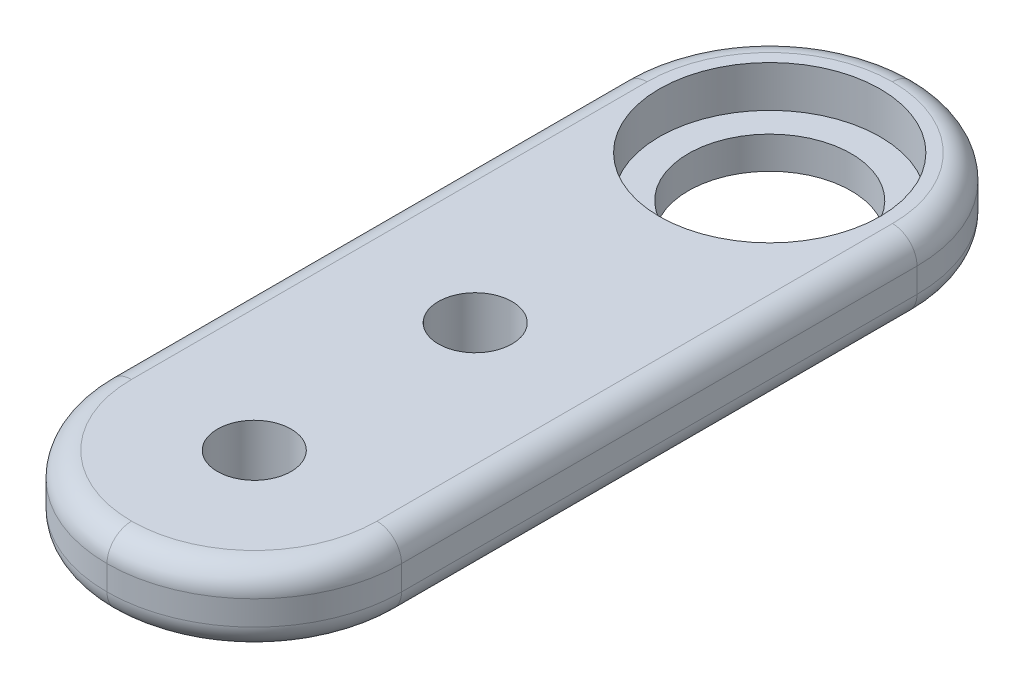
ISO-10303-21;
HEADER;
FILE_DESCRIPTION(('STEP AP214'),'2;1');
FILE_NAME('part.step','',(''),(''),'','','');
FILE_SCHEMA(('AUTOMOTIVE_DESIGN { 1 0 10303 214 1 1 1 1 }'));
ENDSEC;
DATA;
#1=APPLICATION_CONTEXT('core data for automotive mechanical design processes');
#2=APPLICATION_PROTOCOL_DEFINITION('international standard','automotive_design',2000,#1);
#3=PRODUCT_CONTEXT('',#1,'mechanical');
#4=PRODUCT('Part','Part','',(#3));
#5=PRODUCT_RELATED_PRODUCT_CATEGORY('part','',(#4));
#6=PRODUCT_DEFINITION_FORMATION('','',#4);
#7=PRODUCT_DEFINITION_CONTEXT('part definition',#1,'design');
#8=PRODUCT_DEFINITION('design','',#6,#7);
#9=PRODUCT_DEFINITION_SHAPE('','',#8);
#10=(LENGTH_UNIT() NAMED_UNIT(*) SI_UNIT(.MILLI.,.METRE.));
#11=(NAMED_UNIT(*) PLANE_ANGLE_UNIT() SI_UNIT($,.RADIAN.));
#12=(NAMED_UNIT(*) SI_UNIT($,.STERADIAN.) SOLID_ANGLE_UNIT());
#13=UNCERTAINTY_MEASURE_WITH_UNIT(LENGTH_MEASURE(1.E-05),#10,'distance_accuracy_value','');
#14=(GEOMETRIC_REPRESENTATION_CONTEXT(3) GLOBAL_UNCERTAINTY_ASSIGNED_CONTEXT((#13)) GLOBAL_UNIT_ASSIGNED_CONTEXT((#10,
#11,#12)) REPRESENTATION_CONTEXT('',''));
#15=CARTESIAN_POINT('',(0.,0.,0.));
#16=DIRECTION('',(0.,0.,1.));
#17=DIRECTION('',(1.,0.,0.));
#18=AXIS2_PLACEMENT_3D('',#15,#16,#17);
#19=CARTESIAN_POINT('',(0.,6.35,0.));
#20=DIRECTION('',(0.,-1.,0.));
#21=DIRECTION('',(0.,0.,-1.));
#22=AXIS2_PLACEMENT_3D('',#19,#20,#21);
#23=PLANE('',#22);
#24=CARTESIAN_POINT('',(0.,6.35,-22.225));
#25=DIRECTION('',(0.,1.,0.));
#26=DIRECTION('',(0.,0.,1.));
#27=AXIS2_PLACEMENT_3D('',#24,#25,#26);
#28=CIRCLE('',#27,9.525);
#29=CARTESIAN_POINT('',(0.,6.35,-12.7));
#30=VERTEX_POINT('',#29);
#31=EDGE_CURVE('E278',#30,#30,#28,.T.);
#32=ORIENTED_EDGE('',*,*,#31,.F.);
#33=EDGE_LOOP('',(#32));
#34=FACE_BOUND('',#33,.T.);
#35=CARTESIAN_POINT('',(0.,6.35,-22.225));
#36=DIRECTION('',(0.,-1.,0.));
#37=DIRECTION('',(0.,0.,-1.));
#38=AXIS2_PLACEMENT_3D('',#35,#36,#37);
#39=CIRCLE('',#38,10.5833333333333);
#40=CARTESIAN_POINT('',(10.5833333333333,6.35,-22.225));
#41=VERTEX_POINT('',#40);
#42=CARTESIAN_POINT('',(0.,6.35,-32.8083333333333));
#43=VERTEX_POINT('',#42);
#44=EDGE_CURVE('E54',#41,#43,#39,.F.);
#45=ORIENTED_EDGE('',*,*,#44,.T.);
#46=CARTESIAN_POINT('',(0.,6.35,-22.225));
#47=DIRECTION('',(0.,-1.,0.));
#48=DIRECTION('',(0.,0.,-1.));
#49=AXIS2_PLACEMENT_3D('',#46,#47,#48);
#50=CIRCLE('',#49,10.5833333333333);
#51=CARTESIAN_POINT('',(-10.5833333333333,6.35,-22.225));
#52=VERTEX_POINT('',#51);
#53=EDGE_CURVE('E187',#43,#52,#50,.F.);
#54=ORIENTED_EDGE('',*,*,#53,.T.);
#55=DIRECTION('',(0.,0.,1.));
#56=VECTOR('',#55,1.);
#57=CARTESIAN_POINT('',(-10.5833333333333,6.35,0.));
#58=LINE('',#57,#56);
#59=CARTESIAN_POINT('',(-10.5833333333333,6.35,22.225));
#60=VERTEX_POINT('',#59);
#61=EDGE_CURVE('E179',#52,#60,#58,.T.);
#62=ORIENTED_EDGE('',*,*,#61,.T.);
#63=CARTESIAN_POINT('',(0.,6.35,22.225));
#64=DIRECTION('',(0.,-1.,0.));
#65=DIRECTION('',(0.,0.,-1.));
#66=AXIS2_PLACEMENT_3D('',#63,#64,#65);
#67=CIRCLE('',#66,10.5833333333333);
#68=CARTESIAN_POINT('',(0.,6.35,32.8083333333333));
#69=VERTEX_POINT('',#68);
#70=EDGE_CURVE('E181',#60,#69,#67,.F.);
#71=ORIENTED_EDGE('',*,*,#70,.T.);
#72=CARTESIAN_POINT('',(0.,6.35,22.225));
#73=DIRECTION('',(0.,-1.,0.));
#74=DIRECTION('',(0.,0.,-1.));
#75=AXIS2_PLACEMENT_3D('',#72,#73,#74);
#76=CIRCLE('',#75,10.5833333333333);
#77=CARTESIAN_POINT('',(10.5833333333333,6.35,22.225));
#78=VERTEX_POINT('',#77);
#79=EDGE_CURVE('E183',#69,#78,#76,.F.);
#80=ORIENTED_EDGE('',*,*,#79,.T.);
#81=DIRECTION('',(0.,0.,-1.));
#82=VECTOR('',#81,1.);
#83=CARTESIAN_POINT('',(10.5833333333333,6.35,0.));
#84=LINE('',#83,#82);
#85=EDGE_CURVE('E59',#78,#41,#84,.T.);
#86=ORIENTED_EDGE('',*,*,#85,.T.);
#87=EDGE_LOOP('',(#45,#54,#62,#71,#80,#86));
#88=FACE_BOUND('',#87,.T.);
#89=CARTESIAN_POINT('',(0.,6.35,3.175));
#90=DIRECTION('',(0.,1.,0.));
#91=DIRECTION('',(0.,0.,1.));
#92=AXIS2_PLACEMENT_3D('',#89,#90,#91);
#93=CIRCLE('',#92,3.175);
#94=CARTESIAN_POINT('',(0.,6.35,6.35));
#95=VERTEX_POINT('',#94);
#96=EDGE_CURVE('E267',#95,#95,#93,.T.);
#97=ORIENTED_EDGE('',*,*,#96,.F.);
#98=EDGE_LOOP('',(#97));
#99=FACE_BOUND('',#98,.T.);
#100=CARTESIAN_POINT('',(0.,6.35,22.225));
#101=DIRECTION('',(0.,1.,0.));
#102=DIRECTION('',(0.,0.,1.));
#103=AXIS2_PLACEMENT_3D('',#100,#101,#102);
#104=CIRCLE('',#103,3.175);
#105=CARTESIAN_POINT('',(0.,6.35,25.4));
#106=VERTEX_POINT('',#105);
#107=EDGE_CURVE('E271',#106,#106,#104,.T.);
#108=ORIENTED_EDGE('',*,*,#107,.F.);
#109=EDGE_LOOP('',(#108));
#110=FACE_BOUND('',#109,.T.);
#111=ADVANCED_FACE('F37',(#34,#88,#99,#110),#23,.F.);
#112=CARTESIAN_POINT('',(0.,0.,0.));
#113=DIRECTION('',(0.,-1.,0.));
#114=DIRECTION('',(0.,0.,-1.));
#115=AXIS2_PLACEMENT_3D('',#112,#113,#114);
#116=PLANE('',#115);
#117=CARTESIAN_POINT('',(0.,0.,-22.225));
#118=DIRECTION('',(0.,1.,0.));
#119=DIRECTION('',(0.,0.,1.));
#120=AXIS2_PLACEMENT_3D('',#117,#118,#119);
#121=CIRCLE('',#120,7.01680789502882);
#122=CARTESIAN_POINT('',(0.,0.,-15.2081921049712));
#123=VERTEX_POINT('',#122);
#124=EDGE_CURVE('E286',#123,#123,#121,.T.);
#125=ORIENTED_EDGE('',*,*,#124,.T.);
#126=EDGE_LOOP('',(#125));
#127=FACE_BOUND('',#126,.T.);
#128=DIRECTION('',(0.,0.,-1.));
#129=VECTOR('',#128,1.);
#130=CARTESIAN_POINT('',(10.5833333333333,0.,22.225));
#131=LINE('',#130,#129);
#132=CARTESIAN_POINT('',(10.5833333333333,0.,-22.225));
#133=VERTEX_POINT('',#132);
#134=CARTESIAN_POINT('',(10.5833333333333,0.,22.225));
#135=VERTEX_POINT('',#134);
#136=EDGE_CURVE('E152',#133,#135,#131,.F.);
#137=ORIENTED_EDGE('',*,*,#136,.T.);
#138=CARTESIAN_POINT('',(0.,0.,22.225));
#139=DIRECTION('',(0.,-1.,0.));
#140=DIRECTION('',(0.,0.,-1.));
#141=AXIS2_PLACEMENT_3D('',#138,#139,#140);
#142=CIRCLE('',#141,10.5833333333333);
#143=CARTESIAN_POINT('',(0.,0.,32.8083333333333));
#144=VERTEX_POINT('',#143);
#145=EDGE_CURVE('E132',#135,#144,#142,.T.);
#146=ORIENTED_EDGE('',*,*,#145,.T.);
#147=CARTESIAN_POINT('',(0.,0.,22.225));
#148=DIRECTION('',(0.,-1.,0.));
#149=DIRECTION('',(0.,0.,-1.));
#150=AXIS2_PLACEMENT_3D('',#147,#148,#149);
#151=CIRCLE('',#150,10.5833333333333);
#152=CARTESIAN_POINT('',(-10.5833333333333,0.,22.225));
#153=VERTEX_POINT('',#152);
#154=EDGE_CURVE('E140',#144,#153,#151,.T.);
#155=ORIENTED_EDGE('',*,*,#154,.T.);
#156=DIRECTION('',(0.,0.,1.));
#157=VECTOR('',#156,1.);
#158=CARTESIAN_POINT('',(-10.5833333333333,0.,-22.225));
#159=LINE('',#158,#157);
#160=CARTESIAN_POINT('',(-10.5833333333333,0.,-22.225));
#161=VERTEX_POINT('',#160);
#162=EDGE_CURVE('E146',#153,#161,#159,.F.);
#163=ORIENTED_EDGE('',*,*,#162,.T.);
#164=CARTESIAN_POINT('',(0.,0.,-22.225));
#165=DIRECTION('',(0.,-1.,0.));
#166=DIRECTION('',(0.,0.,-1.));
#167=AXIS2_PLACEMENT_3D('',#164,#165,#166);
#168=CIRCLE('',#167,10.5833333333333);
#169=CARTESIAN_POINT('',(0.,0.,-32.8083333333333));
#170=VERTEX_POINT('',#169);
#171=EDGE_CURVE('E245',#161,#170,#168,.T.);
#172=ORIENTED_EDGE('',*,*,#171,.T.);
#173=CARTESIAN_POINT('',(0.,0.,-22.225));
#174=DIRECTION('',(0.,-1.,0.));
#175=DIRECTION('',(0.,0.,-1.));
#176=AXIS2_PLACEMENT_3D('',#173,#174,#175);
#177=CIRCLE('',#176,10.5833333333333);
#178=EDGE_CURVE('E157',#170,#133,#177,.T.);
#179=ORIENTED_EDGE('',*,*,#178,.T.);
#180=EDGE_LOOP('',(#137,#146,#155,#163,#172,#179));
#181=FACE_BOUND('',#180,.T.);
#182=CARTESIAN_POINT('',(0.,0.,3.175));
#183=DIRECTION('',(0.,1.,0.));
#184=DIRECTION('',(0.,0.,1.));
#185=AXIS2_PLACEMENT_3D('',#182,#183,#184);
#186=CIRCLE('',#185,3.175);
#187=CARTESIAN_POINT('',(0.,0.,6.35));
#188=VERTEX_POINT('',#187);
#189=EDGE_CURVE('E268',#188,#188,#186,.T.);
#190=ORIENTED_EDGE('',*,*,#189,.T.);
#191=EDGE_LOOP('',(#190));
#192=FACE_BOUND('',#191,.T.);
#193=CARTESIAN_POINT('',(0.,0.,22.225));
#194=DIRECTION('',(0.,1.,0.));
#195=DIRECTION('',(0.,0.,1.));
#196=AXIS2_PLACEMENT_3D('',#193,#194,#195);
#197=CIRCLE('',#196,3.175);
#198=CARTESIAN_POINT('',(0.,0.,25.4));
#199=VERTEX_POINT('',#198);
#200=EDGE_CURVE('E240',#199,#199,#197,.T.);
#201=ORIENTED_EDGE('',*,*,#200,.T.);
#202=EDGE_LOOP('',(#201));
#203=FACE_BOUND('',#202,.T.);
#204=ADVANCED_FACE('F149',(#127,#181,#192,#203),#116,.T.);
#205=CARTESIAN_POINT('',(12.7,6.35,34.925));
#206=DIRECTION('',(-1.,0.,0.));
#207=DIRECTION('',(0.,0.,1.));
#208=AXIS2_PLACEMENT_3D('',#205,#206,#207);
#209=PLANE('',#208);
#210=DIRECTION('',(0.,-1.,0.));
#211=VECTOR('',#210,1.);
#212=CARTESIAN_POINT('',(12.7,6.35,22.225));
#213=LINE('',#212,#211);
#214=CARTESIAN_POINT('',(12.7,4.23333333333333,22.225));
#215=VERTEX_POINT('',#214);
#216=CARTESIAN_POINT('',(12.7,2.11666666666667,22.225));
#217=VERTEX_POINT('',#216);
#218=EDGE_CURVE('E232',#215,#217,#213,.T.);
#219=ORIENTED_EDGE('',*,*,#218,.T.);
#220=DIRECTION('',(0.,0.,-1.));
#221=VECTOR('',#220,1.);
#222=CARTESIAN_POINT('',(12.7,2.11666666666667,-22.225));
#223=LINE('',#222,#221);
#224=CARTESIAN_POINT('',(12.7,2.11666666666667,-22.225));
#225=VERTEX_POINT('',#224);
#226=EDGE_CURVE('E164',#217,#225,#223,.T.);
#227=ORIENTED_EDGE('',*,*,#226,.T.);
#228=DIRECTION('',(0.,-1.,0.));
#229=VECTOR('',#228,1.);
#230=CARTESIAN_POINT('',(12.7,6.35,-22.225));
#231=LINE('',#230,#229);
#232=CARTESIAN_POINT('',(12.7,4.23333333333333,-22.225));
#233=VERTEX_POINT('',#232);
#234=EDGE_CURVE('E147',#225,#233,#231,.F.);
#235=ORIENTED_EDGE('',*,*,#234,.T.);
#236=DIRECTION('',(0.,0.,-1.));
#237=VECTOR('',#236,1.);
#238=CARTESIAN_POINT('',(12.7,4.23333333333333,34.925));
#239=LINE('',#238,#237);
#240=EDGE_CURVE('E162',#233,#215,#239,.F.);
#241=ORIENTED_EDGE('',*,*,#240,.T.);
#242=EDGE_LOOP('',(#219,#227,#235,#241));
#243=FACE_BOUND('',#242,.T.);
#244=ADVANCED_FACE('F259',(#243),#209,.F.);
#245=CARTESIAN_POINT('',(-12.7,6.35,34.925));
#246=DIRECTION('',(1.,0.,0.));
#247=DIRECTION('',(0.,0.,-1.));
#248=AXIS2_PLACEMENT_3D('',#245,#246,#247);
#249=PLANE('',#248);
#250=DIRECTION('',(0.,-1.,0.));
#251=VECTOR('',#250,1.);
#252=CARTESIAN_POINT('',(-12.7,6.35,-22.225));
#253=LINE('',#252,#251);
#254=CARTESIAN_POINT('',(-12.7,4.23333333333333,-22.225));
#255=VERTEX_POINT('',#254);
#256=CARTESIAN_POINT('',(-12.7,2.11666666666667,-22.225));
#257=VERTEX_POINT('',#256);
#258=EDGE_CURVE('E260',#255,#257,#253,.T.);
#259=ORIENTED_EDGE('',*,*,#258,.T.);
#260=DIRECTION('',(0.,0.,1.));
#261=VECTOR('',#260,1.);
#262=CARTESIAN_POINT('',(-12.7,2.11666666666667,22.225));
#263=LINE('',#262,#261);
#264=CARTESIAN_POINT('',(-12.7,2.11666666666667,22.225));
#265=VERTEX_POINT('',#264);
#266=EDGE_CURVE('E177',#257,#265,#263,.T.);
#267=ORIENTED_EDGE('',*,*,#266,.T.);
#268=DIRECTION('',(0.,-1.,0.));
#269=VECTOR('',#268,1.);
#270=CARTESIAN_POINT('',(-12.7,6.35,22.225));
#271=LINE('',#270,#269);
#272=CARTESIAN_POINT('',(-12.7,4.23333333333333,22.225));
#273=VERTEX_POINT('',#272);
#274=EDGE_CURVE('E263',#265,#273,#271,.F.);
#275=ORIENTED_EDGE('',*,*,#274,.T.);
#276=DIRECTION('',(0.,0.,1.));
#277=VECTOR('',#276,1.);
#278=CARTESIAN_POINT('',(-12.7,4.23333333333333,34.925));
#279=LINE('',#278,#277);
#280=EDGE_CURVE('E175',#273,#255,#279,.F.);
#281=ORIENTED_EDGE('',*,*,#280,.T.);
#282=EDGE_LOOP('',(#259,#267,#275,#281));
#283=FACE_BOUND('',#282,.T.);
#284=ADVANCED_FACE('F314',(#283),#249,.F.);
#285=CARTESIAN_POINT('',(0.,6.35,3.175));
#286=DIRECTION('',(0.,-1.,0.));
#287=DIRECTION('',(0.,0.,-1.));
#288=AXIS2_PLACEMENT_3D('',#285,#286,#287);
#289=CYLINDRICAL_SURFACE('',#288,3.175);
#290=ORIENTED_EDGE('',*,*,#96,.T.);
#291=EDGE_LOOP('',(#290));
#292=FACE_BOUND('',#291,.T.);
#293=ORIENTED_EDGE('',*,*,#189,.F.);
#294=EDGE_LOOP('',(#293));
#295=FACE_BOUND('',#294,.T.);
#296=ADVANCED_FACE('F311',(#292,#295),#289,.F.);
#297=CARTESIAN_POINT('',(0.,6.35,22.225));
#298=DIRECTION('',(0.,-1.,0.));
#299=DIRECTION('',(0.,0.,-1.));
#300=AXIS2_PLACEMENT_3D('',#297,#298,#299);
#301=CYLINDRICAL_SURFACE('',#300,3.175);
#302=ORIENTED_EDGE('',*,*,#107,.T.);
#303=EDGE_LOOP('',(#302));
#304=FACE_BOUND('',#303,.T.);
#305=ORIENTED_EDGE('',*,*,#200,.F.);
#306=EDGE_LOOP('',(#305));
#307=FACE_BOUND('',#306,.T.);
#308=ADVANCED_FACE('F327',(#304,#307),#301,.F.);
#309=CARTESIAN_POINT('',(0.,6.35,-22.225));
#310=DIRECTION('',(0.,-1.,0.));
#311=DIRECTION('',(0.,0.,-1.));
#312=AXIS2_PLACEMENT_3D('',#309,#310,#311);
#313=CYLINDRICAL_SURFACE('',#312,12.7);
#314=ORIENTED_EDGE('',*,*,#234,.F.);
#315=CARTESIAN_POINT('',(0.,2.11666666666667,-22.225));
#316=DIRECTION('',(0.,-1.,0.));
#317=DIRECTION('',(0.,0.,-1.));
#318=AXIS2_PLACEMENT_3D('',#315,#316,#317);
#319=CIRCLE('',#318,12.7);
#320=CARTESIAN_POINT('',(0.,2.11666666666667,-34.925));
#321=VERTEX_POINT('',#320);
#322=EDGE_CURVE('E168',#225,#321,#319,.F.);
#323=ORIENTED_EDGE('',*,*,#322,.T.);
#324=DIRECTION('',(0.,-1.,0.));
#325=VECTOR('',#324,1.);
#326=CARTESIAN_POINT('',(0.,6.35,-34.925));
#327=LINE('',#326,#325);
#328=CARTESIAN_POINT('',(0.,4.23333333333333,-34.925));
#329=VERTEX_POINT('',#328);
#330=EDGE_CURVE('E237',#329,#321,#327,.T.);
#331=ORIENTED_EDGE('',*,*,#330,.F.);
#332=CARTESIAN_POINT('',(0.,4.23333333333333,-22.225));
#333=DIRECTION('',(0.,-1.,0.));
#334=DIRECTION('',(0.,0.,-1.));
#335=AXIS2_PLACEMENT_3D('',#332,#333,#334);
#336=CIRCLE('',#335,12.7);
#337=EDGE_CURVE('E166',#329,#233,#336,.T.);
#338=ORIENTED_EDGE('',*,*,#337,.T.);
#339=EDGE_LOOP('',(#314,#323,#331,#338));
#340=FACE_BOUND('',#339,.T.);
#341=ADVANCED_FACE('F323',(#340),#313,.T.);
#342=CARTESIAN_POINT('',(0.,6.35,-22.225));
#343=DIRECTION('',(0.,-1.,0.));
#344=DIRECTION('',(0.,0.,-1.));
#345=AXIS2_PLACEMENT_3D('',#342,#343,#344);
#346=CYLINDRICAL_SURFACE('',#345,12.7);
#347=ORIENTED_EDGE('',*,*,#330,.T.);
#348=CARTESIAN_POINT('',(0.,2.11666666666667,-22.225));
#349=DIRECTION('',(0.,-1.,0.));
#350=DIRECTION('',(0.,0.,-1.));
#351=AXIS2_PLACEMENT_3D('',#348,#349,#350);
#352=CIRCLE('',#351,12.7);
#353=EDGE_CURVE('E173',#321,#257,#352,.F.);
#354=ORIENTED_EDGE('',*,*,#353,.T.);
#355=ORIENTED_EDGE('',*,*,#258,.F.);
#356=CARTESIAN_POINT('',(0.,4.23333333333333,-22.225));
#357=DIRECTION('',(0.,-1.,0.));
#358=DIRECTION('',(0.,0.,-1.));
#359=AXIS2_PLACEMENT_3D('',#356,#357,#358);
#360=CIRCLE('',#359,12.7);
#361=EDGE_CURVE('E170',#255,#329,#360,.T.);
#362=ORIENTED_EDGE('',*,*,#361,.T.);
#363=EDGE_LOOP('',(#347,#354,#355,#362));
#364=FACE_BOUND('',#363,.T.);
#365=ADVANCED_FACE('F320',(#364),#346,.T.);
#366=CARTESIAN_POINT('',(0.,6.35,22.225));
#367=DIRECTION('',(0.,-1.,0.));
#368=DIRECTION('',(0.,0.,-1.));
#369=AXIS2_PLACEMENT_3D('',#366,#367,#368);
#370=CYLINDRICAL_SURFACE('',#369,12.7);
#371=DIRECTION('',(0.,-1.,0.));
#372=VECTOR('',#371,1.);
#373=CARTESIAN_POINT('',(0.,6.35,34.925));
#374=LINE('',#373,#372);
#375=CARTESIAN_POINT('',(0.,2.11666666666667,34.925));
#376=VERTEX_POINT('',#375);
#377=CARTESIAN_POINT('',(0.,4.23333333333333,34.925));
#378=VERTEX_POINT('',#377);
#379=EDGE_CURVE('E201',#376,#378,#374,.F.);
#380=ORIENTED_EDGE('',*,*,#379,.F.);
#381=CARTESIAN_POINT('',(0.,2.11666666666667,22.225));
#382=DIRECTION('',(0.,-1.,0.));
#383=DIRECTION('',(0.,0.,-1.));
#384=AXIS2_PLACEMENT_3D('',#381,#382,#383);
#385=CIRCLE('',#384,12.7);
#386=EDGE_CURVE('E134',#376,#217,#385,.F.);
#387=ORIENTED_EDGE('',*,*,#386,.T.);
#388=ORIENTED_EDGE('',*,*,#218,.F.);
#389=CARTESIAN_POINT('',(0.,4.23333333333333,22.225));
#390=DIRECTION('',(0.,-1.,0.));
#391=DIRECTION('',(0.,0.,-1.));
#392=AXIS2_PLACEMENT_3D('',#389,#390,#391);
#393=CIRCLE('',#392,12.7);
#394=EDGE_CURVE('E154',#215,#378,#393,.T.);
#395=ORIENTED_EDGE('',*,*,#394,.T.);
#396=EDGE_LOOP('',(#380,#387,#388,#395));
#397=FACE_BOUND('',#396,.T.);
#398=ADVANCED_FACE('F230',(#397),#370,.T.);
#399=CARTESIAN_POINT('',(0.,6.35,22.225));
#400=DIRECTION('',(0.,-1.,0.));
#401=DIRECTION('',(0.,0.,-1.));
#402=AXIS2_PLACEMENT_3D('',#399,#400,#401);
#403=CYLINDRICAL_SURFACE('',#402,12.7);
#404=ORIENTED_EDGE('',*,*,#379,.T.);
#405=CARTESIAN_POINT('',(0.,4.23333333333333,22.225));
#406=DIRECTION('',(0.,-1.,0.));
#407=DIRECTION('',(0.,0.,-1.));
#408=AXIS2_PLACEMENT_3D('',#405,#406,#407);
#409=CIRCLE('',#408,12.7);
#410=EDGE_CURVE('E11',#378,#273,#409,.T.);
#411=ORIENTED_EDGE('',*,*,#410,.T.);
#412=ORIENTED_EDGE('',*,*,#274,.F.);
#413=CARTESIAN_POINT('',(0.,2.11666666666667,22.225));
#414=DIRECTION('',(0.,-1.,0.));
#415=DIRECTION('',(0.,0.,-1.));
#416=AXIS2_PLACEMENT_3D('',#413,#414,#415);
#417=CIRCLE('',#416,12.7);
#418=EDGE_CURVE('E46',#265,#376,#417,.F.);
#419=ORIENTED_EDGE('',*,*,#418,.T.);
#420=EDGE_LOOP('',(#404,#411,#412,#419));
#421=FACE_BOUND('',#420,.T.);
#422=ADVANCED_FACE('F234',(#421),#403,.T.);
#423=CARTESIAN_POINT('',(0.,2.11666666666667,-22.225));
#424=DIRECTION('',(0.,-1.,0.));
#425=DIRECTION('',(0.,0.,-1.));
#426=AXIS2_PLACEMENT_3D('',#423,#424,#425);
#427=TOROIDAL_SURFACE('',#426,10.5833333333333,2.11666666666667);
#428=CARTESIAN_POINT('',(-10.5833333333333,2.11666666666667,-22.225));
#429=DIRECTION('',(0.,0.,1.));
#430=DIRECTION('',(1.,0.,0.));
#431=AXIS2_PLACEMENT_3D('',#428,#429,#430);
#432=CIRCLE('',#431,2.11666666666667);
#433=EDGE_CURVE('E195',#257,#161,#432,.T.);
#434=ORIENTED_EDGE('',*,*,#433,.F.);
#435=ORIENTED_EDGE('',*,*,#353,.F.);
#436=CARTESIAN_POINT('',(0.,2.11666666666667,-32.8083333333333));
#437=DIRECTION('',(1.,0.,0.));
#438=DIRECTION('',(0.,0.,-1.));
#439=AXIS2_PLACEMENT_3D('',#436,#437,#438);
#440=CIRCLE('',#439,2.11666666666667);
#441=EDGE_CURVE('E198',#170,#321,#440,.T.);
#442=ORIENTED_EDGE('',*,*,#441,.F.);
#443=ORIENTED_EDGE('',*,*,#171,.F.);
#444=EDGE_LOOP('',(#434,#435,#442,#443));
#445=FACE_BOUND('',#444,.T.);
#446=ADVANCED_FACE('F331',(#445),#427,.T.);
#447=CARTESIAN_POINT('',(0.,2.11666666666667,-22.225));
#448=DIRECTION('',(0.,-1.,0.));
#449=DIRECTION('',(0.,0.,-1.));
#450=AXIS2_PLACEMENT_3D('',#447,#448,#449);
#451=TOROIDAL_SURFACE('',#450,10.5833333333333,2.11666666666667);
#452=ORIENTED_EDGE('',*,*,#441,.T.);
#453=ORIENTED_EDGE('',*,*,#322,.F.);
#454=CARTESIAN_POINT('',(10.5833333333333,2.11666666666667,-22.225));
#455=DIRECTION('',(0.,0.,1.));
#456=DIRECTION('',(1.,0.,0.));
#457=AXIS2_PLACEMENT_3D('',#454,#455,#456);
#458=CIRCLE('',#457,2.11666666666667);
#459=EDGE_CURVE('E192',#133,#225,#458,.T.);
#460=ORIENTED_EDGE('',*,*,#459,.F.);
#461=ORIENTED_EDGE('',*,*,#178,.F.);
#462=EDGE_LOOP('',(#452,#453,#460,#461));
#463=FACE_BOUND('',#462,.T.);
#464=ADVANCED_FACE('F252',(#463),#451,.T.);
#465=CARTESIAN_POINT('',(-10.5833333333333,2.11666666666667,34.925));
#466=DIRECTION('',(0.,0.,-1.));
#467=DIRECTION('',(-1.,0.,0.));
#468=AXIS2_PLACEMENT_3D('',#465,#466,#467);
#469=CYLINDRICAL_SURFACE('',#468,2.11666666666667);
#470=ORIENTED_EDGE('',*,*,#433,.T.);
#471=ORIENTED_EDGE('',*,*,#162,.F.);
#472=CARTESIAN_POINT('',(-10.5833333333333,2.11666666666667,22.225));
#473=DIRECTION('',(0.,0.,1.));
#474=DIRECTION('',(1.,0.,0.));
#475=AXIS2_PLACEMENT_3D('',#472,#473,#474);
#476=CIRCLE('',#475,2.11666666666667);
#477=EDGE_CURVE('E143',#265,#153,#476,.T.);
#478=ORIENTED_EDGE('',*,*,#477,.F.);
#479=ORIENTED_EDGE('',*,*,#266,.F.);
#480=EDGE_LOOP('',(#470,#471,#478,#479));
#481=FACE_BOUND('',#480,.T.);
#482=ADVANCED_FACE('F340',(#481),#469,.T.);
#483=CARTESIAN_POINT('',(10.5833333333334,2.11666666666667,34.925));
#484=DIRECTION('',(0.,0.,1.));
#485=DIRECTION('',(1.,0.,0.));
#486=AXIS2_PLACEMENT_3D('',#483,#484,#485);
#487=CYLINDRICAL_SURFACE('',#486,2.11666666666667);
#488=ORIENTED_EDGE('',*,*,#459,.T.);
#489=ORIENTED_EDGE('',*,*,#226,.F.);
#490=CARTESIAN_POINT('',(10.5833333333333,2.11666666666667,22.225));
#491=DIRECTION('',(0.,0.,1.));
#492=DIRECTION('',(1.,0.,0.));
#493=AXIS2_PLACEMENT_3D('',#490,#491,#492);
#494=CIRCLE('',#493,2.11666666666667);
#495=EDGE_CURVE('E137',#135,#217,#494,.T.);
#496=ORIENTED_EDGE('',*,*,#495,.F.);
#497=ORIENTED_EDGE('',*,*,#136,.F.);
#498=EDGE_LOOP('',(#488,#489,#496,#497));
#499=FACE_BOUND('',#498,.T.);
#500=ADVANCED_FACE('F255',(#499),#487,.T.);
#501=CARTESIAN_POINT('',(0.,2.11666666666667,22.225));
#502=DIRECTION('',(0.,-1.,0.));
#503=DIRECTION('',(0.,0.,-1.));
#504=AXIS2_PLACEMENT_3D('',#501,#502,#503);
#505=TOROIDAL_SURFACE('',#504,10.5833333333333,2.11666666666667);
#506=ORIENTED_EDGE('',*,*,#477,.T.);
#507=ORIENTED_EDGE('',*,*,#154,.F.);
#508=CARTESIAN_POINT('',(0.,2.11666666666667,32.8083333333333));
#509=DIRECTION('',(1.,0.,0.));
#510=DIRECTION('',(0.,0.,-1.));
#511=AXIS2_PLACEMENT_3D('',#508,#509,#510);
#512=CIRCLE('',#511,2.11666666666667);
#513=EDGE_CURVE('E128',#376,#144,#512,.T.);
#514=ORIENTED_EDGE('',*,*,#513,.F.);
#515=ORIENTED_EDGE('',*,*,#418,.F.);
#516=EDGE_LOOP('',(#506,#507,#514,#515));
#517=FACE_BOUND('',#516,.T.);
#518=ADVANCED_FACE('F141',(#517),#505,.T.);
#519=CARTESIAN_POINT('',(0.,2.11666666666667,22.225));
#520=DIRECTION('',(0.,-1.,0.));
#521=DIRECTION('',(0.,0.,-1.));
#522=AXIS2_PLACEMENT_3D('',#519,#520,#521);
#523=TOROIDAL_SURFACE('',#522,10.5833333333333,2.11666666666667);
#524=ORIENTED_EDGE('',*,*,#495,.T.);
#525=ORIENTED_EDGE('',*,*,#386,.F.);
#526=ORIENTED_EDGE('',*,*,#513,.T.);
#527=ORIENTED_EDGE('',*,*,#145,.F.);
#528=EDGE_LOOP('',(#524,#525,#526,#527));
#529=FACE_BOUND('',#528,.T.);
#530=ADVANCED_FACE('F130',(#529),#523,.T.);
#531=CARTESIAN_POINT('',(0.,4.23333333333333,22.225));
#532=DIRECTION('',(0.,-1.,0.));
#533=DIRECTION('',(0.,0.,-1.));
#534=AXIS2_PLACEMENT_3D('',#531,#532,#533);
#535=TOROIDAL_SURFACE('',#534,10.5833333333333,2.11666666666667);
#536=CARTESIAN_POINT('',(0.,4.23333333333333,32.8083333333333));
#537=DIRECTION('',(-1.,0.,0.));
#538=DIRECTION('',(0.,0.,1.));
#539=AXIS2_PLACEMENT_3D('',#536,#537,#538);
#540=CIRCLE('',#539,2.11666666666667);
#541=EDGE_CURVE('E212',#378,#69,#540,.T.);
#542=ORIENTED_EDGE('',*,*,#541,.F.);
#543=ORIENTED_EDGE('',*,*,#394,.F.);
#544=CARTESIAN_POINT('',(10.5833333333333,4.23333333333333,22.225));
#545=DIRECTION('',(0.,0.,-1.));
#546=DIRECTION('',(-1.,0.,0.));
#547=AXIS2_PLACEMENT_3D('',#544,#545,#546);
#548=CIRCLE('',#547,2.11666666666667);
#549=EDGE_CURVE('E41',#78,#215,#548,.T.);
#550=ORIENTED_EDGE('',*,*,#549,.F.);
#551=ORIENTED_EDGE('',*,*,#79,.F.);
#552=EDGE_LOOP('',(#542,#543,#550,#551));
#553=FACE_BOUND('',#552,.T.);
#554=ADVANCED_FACE('F39',(#553),#535,.T.);
#555=CARTESIAN_POINT('',(10.5833333333333,4.23333333333333,0.));
#556=DIRECTION('',(0.,0.,-1.));
#557=DIRECTION('',(-1.,0.,0.));
#558=AXIS2_PLACEMENT_3D('',#555,#556,#557);
#559=CYLINDRICAL_SURFACE('',#558,2.11666666666667);
#560=ORIENTED_EDGE('',*,*,#549,.T.);
#561=ORIENTED_EDGE('',*,*,#240,.F.);
#562=CARTESIAN_POINT('',(10.5833333333333,4.23333333333333,-22.225));
#563=DIRECTION('',(0.,0.,-1.));
#564=DIRECTION('',(-1.,0.,0.));
#565=AXIS2_PLACEMENT_3D('',#562,#563,#564);
#566=CIRCLE('',#565,2.11666666666667);
#567=EDGE_CURVE('E210',#41,#233,#566,.T.);
#568=ORIENTED_EDGE('',*,*,#567,.F.);
#569=ORIENTED_EDGE('',*,*,#85,.F.);
#570=EDGE_LOOP('',(#560,#561,#568,#569));
#571=FACE_BOUND('',#570,.T.);
#572=ADVANCED_FACE('F222',(#571),#559,.T.);
#573=CARTESIAN_POINT('',(0.,4.23333333333333,22.225));
#574=DIRECTION('',(0.,-1.,0.));
#575=DIRECTION('',(0.,0.,-1.));
#576=AXIS2_PLACEMENT_3D('',#573,#574,#575);
#577=TOROIDAL_SURFACE('',#576,10.5833333333333,2.11666666666667);
#578=ORIENTED_EDGE('',*,*,#541,.T.);
#579=ORIENTED_EDGE('',*,*,#70,.F.);
#580=CARTESIAN_POINT('',(-10.5833333333333,4.23333333333333,22.225));
#581=DIRECTION('',(0.,0.,-1.));
#582=DIRECTION('',(-1.,0.,0.));
#583=AXIS2_PLACEMENT_3D('',#580,#581,#582);
#584=CIRCLE('',#583,2.11666666666667);
#585=EDGE_CURVE('E207',#273,#60,#584,.T.);
#586=ORIENTED_EDGE('',*,*,#585,.F.);
#587=ORIENTED_EDGE('',*,*,#410,.F.);
#588=EDGE_LOOP('',(#578,#579,#586,#587));
#589=FACE_BOUND('',#588,.T.);
#590=ADVANCED_FACE('F360',(#589),#577,.T.);
#591=CARTESIAN_POINT('',(0.,4.23333333333333,-22.225));
#592=DIRECTION('',(0.,-1.,0.));
#593=DIRECTION('',(0.,0.,-1.));
#594=AXIS2_PLACEMENT_3D('',#591,#592,#593);
#595=TOROIDAL_SURFACE('',#594,10.5833333333333,2.11666666666667);
#596=ORIENTED_EDGE('',*,*,#567,.T.);
#597=ORIENTED_EDGE('',*,*,#337,.F.);
#598=CARTESIAN_POINT('',(0.,4.23333333333333,-32.8083333333333));
#599=DIRECTION('',(-1.,0.,0.));
#600=DIRECTION('',(0.,0.,1.));
#601=AXIS2_PLACEMENT_3D('',#598,#599,#600);
#602=CIRCLE('',#601,2.11666666666667);
#603=EDGE_CURVE('E204',#43,#329,#602,.T.);
#604=ORIENTED_EDGE('',*,*,#603,.F.);
#605=ORIENTED_EDGE('',*,*,#44,.F.);
#606=EDGE_LOOP('',(#596,#597,#604,#605));
#607=FACE_BOUND('',#606,.T.);
#608=ADVANCED_FACE('F356',(#607),#595,.T.);
#609=CARTESIAN_POINT('',(-10.5833333333333,4.23333333333333,0.));
#610=DIRECTION('',(0.,0.,1.));
#611=DIRECTION('',(1.,0.,0.));
#612=AXIS2_PLACEMENT_3D('',#609,#610,#611);
#613=CYLINDRICAL_SURFACE('',#612,2.11666666666667);
#614=ORIENTED_EDGE('',*,*,#585,.T.);
#615=ORIENTED_EDGE('',*,*,#61,.F.);
#616=CARTESIAN_POINT('',(-10.5833333333333,4.23333333333333,-22.225));
#617=DIRECTION('',(0.,0.,-1.));
#618=DIRECTION('',(-1.,0.,0.));
#619=AXIS2_PLACEMENT_3D('',#616,#617,#618);
#620=CIRCLE('',#619,2.11666666666667);
#621=EDGE_CURVE('E202',#255,#52,#620,.T.);
#622=ORIENTED_EDGE('',*,*,#621,.F.);
#623=ORIENTED_EDGE('',*,*,#280,.F.);
#624=EDGE_LOOP('',(#614,#615,#622,#623));
#625=FACE_BOUND('',#624,.T.);
#626=ADVANCED_FACE('F352',(#625),#613,.T.);
#627=CARTESIAN_POINT('',(0.,4.23333333333333,-22.225));
#628=DIRECTION('',(0.,-1.,0.));
#629=DIRECTION('',(0.,0.,-1.));
#630=AXIS2_PLACEMENT_3D('',#627,#628,#629);
#631=TOROIDAL_SURFACE('',#630,10.5833333333333,2.11666666666667);
#632=ORIENTED_EDGE('',*,*,#603,.T.);
#633=ORIENTED_EDGE('',*,*,#361,.F.);
#634=ORIENTED_EDGE('',*,*,#621,.T.);
#635=ORIENTED_EDGE('',*,*,#53,.F.);
#636=EDGE_LOOP('',(#632,#633,#634,#635));
#637=FACE_BOUND('',#636,.T.);
#638=ADVANCED_FACE('F349',(#637),#631,.T.);
#639=CARTESIAN_POINT('',(0.,2.778125,-22.225));
#640=DIRECTION('',(0.,1.,0.));
#641=DIRECTION('',(0.,0.,1.));
#642=AXIS2_PLACEMENT_3D('',#639,#640,#641);
#643=CYLINDRICAL_SURFACE('',#642,9.525);
#644=CARTESIAN_POINT('',(0.,2.778125,-22.225));
#645=DIRECTION('',(0.,1.,0.));
#646=DIRECTION('',(0.,0.,1.));
#647=AXIS2_PLACEMENT_3D('',#644,#645,#646);
#648=CIRCLE('',#647,9.525);
#649=CARTESIAN_POINT('',(0.,2.778125,-12.7));
#650=VERTEX_POINT('',#649);
#651=EDGE_CURVE('E205',#650,#650,#648,.T.);
#652=ORIENTED_EDGE('',*,*,#651,.F.);
#653=EDGE_LOOP('',(#652));
#654=FACE_BOUND('',#653,.T.);
#655=ORIENTED_EDGE('',*,*,#31,.T.);
#656=EDGE_LOOP('',(#655));
#657=FACE_BOUND('',#656,.T.);
#658=ADVANCED_FACE('F299',(#654,#657),#643,.F.);
#659=CARTESIAN_POINT('',(0.,2.778125,-22.225));
#660=DIRECTION('',(0.,1.,0.));
#661=DIRECTION('',(0.,0.,1.));
#662=AXIS2_PLACEMENT_3D('',#659,#660,#661);
#663=PLANE('',#662);
#664=CARTESIAN_POINT('',(0.,2.778125,-22.225));
#665=DIRECTION('',(0.,1.,0.));
#666=DIRECTION('',(0.,0.,1.));
#667=AXIS2_PLACEMENT_3D('',#664,#665,#666);
#668=CIRCLE('',#667,7.01680789502882);
#669=CARTESIAN_POINT('',(0.,2.778125,-15.2081921049712));
#670=VERTEX_POINT('',#669);
#671=EDGE_CURVE('E281',#670,#670,#668,.T.);
#672=ORIENTED_EDGE('',*,*,#671,.F.);
#673=EDGE_LOOP('',(#672));
#674=FACE_BOUND('',#673,.T.);
#675=ORIENTED_EDGE('',*,*,#651,.T.);
#676=EDGE_LOOP('',(#675));
#677=FACE_BOUND('',#676,.T.);
#678=ADVANCED_FACE('F293',(#674,#677),#663,.T.);
#679=CARTESIAN_POINT('',(0.,0.,-22.225));
#680=DIRECTION('',(0.,1.,0.));
#681=DIRECTION('',(0.,0.,1.));
#682=AXIS2_PLACEMENT_3D('',#679,#680,#681);
#683=CYLINDRICAL_SURFACE('',#682,7.01680789502882);
#684=ORIENTED_EDGE('',*,*,#671,.T.);
#685=EDGE_LOOP('',(#684));
#686=FACE_BOUND('',#685,.T.);
#687=ORIENTED_EDGE('',*,*,#124,.F.);
#688=EDGE_LOOP('',(#687));
#689=FACE_BOUND('',#688,.T.);
#690=ADVANCED_FACE('F291',(#686,#689),#683,.F.);
#691=CLOSED_SHELL('',(#111,#204,#244,#284,#296,#308,#341,#365,#398,#422,#446,#464,#482,#500,
#518,#530,#554,#572,#590,#608,#626,#638,#658,#678,#690));
#692=MANIFOLD_SOLID_BREP('B2',#691);
#693=ADVANCED_BREP_SHAPE_REPRESENTATION('',(#18,#692),#14);
#694=SHAPE_DEFINITION_REPRESENTATION(#9,#693);
ENDSEC;
END-ISO-10303-21;
